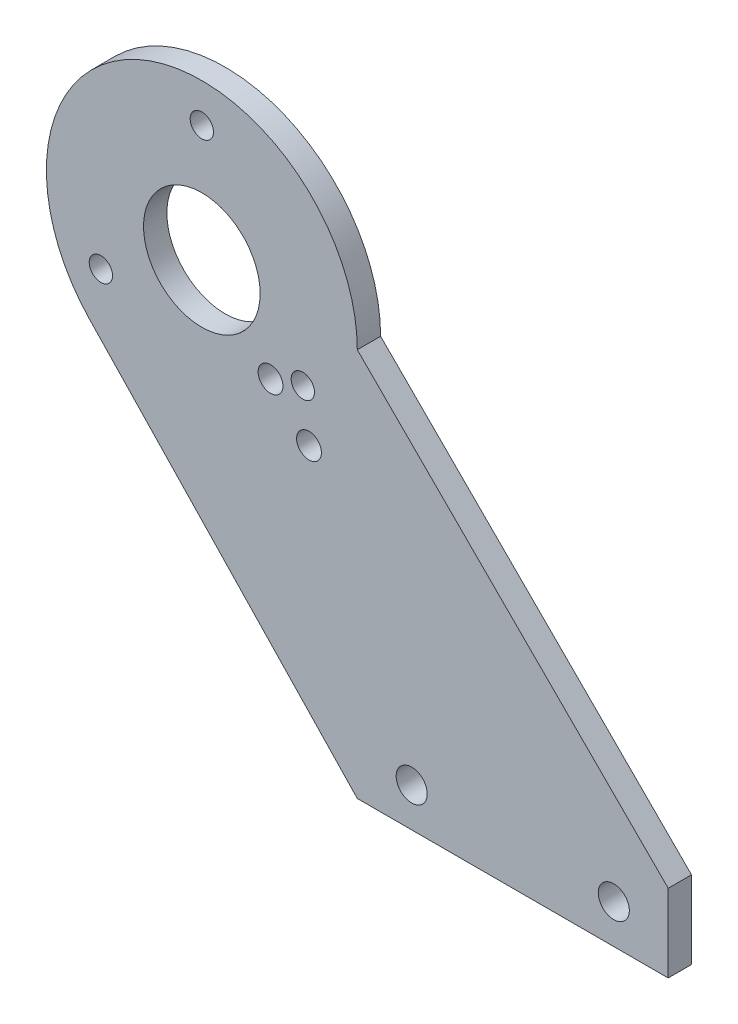
ISO-10303-21;
HEADER;
FILE_DESCRIPTION(('STEP AP214'),'2;1');
FILE_NAME('part.step','',(''),(''),'','','');
FILE_SCHEMA(('AUTOMOTIVE_DESIGN { 1 0 10303 214 1 1 1 1 }'));
ENDSEC;
DATA;
#1=APPLICATION_CONTEXT('core data for automotive mechanical design processes');
#2=APPLICATION_PROTOCOL_DEFINITION('international standard','automotive_design',2000,#1);
#3=PRODUCT_CONTEXT('',#1,'mechanical');
#4=PRODUCT('Part','Part','',(#3));
#5=PRODUCT_RELATED_PRODUCT_CATEGORY('part','',(#4));
#6=PRODUCT_DEFINITION_FORMATION('','',#4);
#7=PRODUCT_DEFINITION_CONTEXT('part definition',#1,'design');
#8=PRODUCT_DEFINITION('design','',#6,#7);
#9=PRODUCT_DEFINITION_SHAPE('','',#8);
#10=(LENGTH_UNIT() NAMED_UNIT(*) SI_UNIT(.MILLI.,.METRE.));
#11=(NAMED_UNIT(*) PLANE_ANGLE_UNIT() SI_UNIT($,.RADIAN.));
#12=(NAMED_UNIT(*) SI_UNIT($,.STERADIAN.) SOLID_ANGLE_UNIT());
#13=UNCERTAINTY_MEASURE_WITH_UNIT(LENGTH_MEASURE(1.E-05),#10,'distance_accuracy_value','');
#14=(GEOMETRIC_REPRESENTATION_CONTEXT(3) GLOBAL_UNCERTAINTY_ASSIGNED_CONTEXT((#13)) GLOBAL_UNIT_ASSIGNED_CONTEXT((#10,
#11,#12)) REPRESENTATION_CONTEXT('',''));
#15=CARTESIAN_POINT('',(0.,0.,0.));
#16=DIRECTION('',(0.,0.,1.));
#17=DIRECTION('',(1.,0.,0.));
#18=AXIS2_PLACEMENT_3D('',#15,#16,#17);
#19=CARTESIAN_POINT('',(0.,0.,3.));
#20=DIRECTION('',(0.,0.,1.));
#21=DIRECTION('',(1.,0.,0.));
#22=AXIS2_PLACEMENT_3D('',#19,#20,#21);
#23=PLANE('',#22);
#24=CARTESIAN_POINT('',(0.,0.,3.));
#25=DIRECTION('',(0.,0.,1.));
#26=DIRECTION('',(1.,0.,0.));
#27=AXIS2_PLACEMENT_3D('',#24,#25,#26);
#28=CIRCLE('',#27,7.5);
#29=CARTESIAN_POINT('',(7.5,0.,3.));
#30=VERTEX_POINT('',#29);
#31=EDGE_CURVE('E131',#30,#30,#28,.T.);
#32=ORIENTED_EDGE('',*,*,#31,.F.);
#33=EDGE_LOOP('',(#32));
#34=FACE_BOUND('',#33,.T.);
#35=CARTESIAN_POINT('',(12.9903810567675,-7.49999999999945,3.));
#36=DIRECTION('',(0.,0.,1.));
#37=DIRECTION('',(1.,0.,0.));
#38=AXIS2_PLACEMENT_3D('',#35,#36,#37);
#39=CIRCLE('',#38,1.50000000000082);
#40=CARTESIAN_POINT('',(14.4903810567684,-7.49999999999945,3.));
#41=VERTEX_POINT('',#40);
#42=EDGE_CURVE('E373',#41,#41,#39,.T.);
#43=ORIENTED_EDGE('',*,*,#42,.F.);
#44=EDGE_LOOP('',(#43));
#45=FACE_BOUND('',#44,.T.);
#46=CARTESIAN_POINT('',(-12.9903810567656,-7.50000000000055,3.));
#47=DIRECTION('',(0.,0.,1.));
#48=DIRECTION('',(1.,0.,0.));
#49=AXIS2_PLACEMENT_3D('',#46,#47,#48);
#50=CIRCLE('',#49,1.5000000000012);
#51=CARTESIAN_POINT('',(-11.4903810567644,-7.50000000000055,3.));
#52=VERTEX_POINT('',#51);
#53=EDGE_CURVE('E376',#52,#52,#50,.T.);
#54=ORIENTED_EDGE('',*,*,#53,.F.);
#55=EDGE_LOOP('',(#54));
#56=FACE_BOUND('',#55,.T.);
#57=CARTESIAN_POINT('',(13.7885822331377,-13.7885822331377,3.));
#58=DIRECTION('',(0.,0.,1.));
#59=DIRECTION('',(1.,0.,0.));
#60=AXIS2_PLACEMENT_3D('',#57,#58,#59);
#61=CIRCLE('',#60,1.6);
#62=CARTESIAN_POINT('',(15.3885822331377,-13.7885822331377,3.));
#63=VERTEX_POINT('',#62);
#64=EDGE_CURVE('E380',#63,#63,#61,.T.);
#65=ORIENTED_EDGE('',*,*,#64,.F.);
#66=EDGE_LOOP('',(#65));
#67=FACE_BOUND('',#66,.T.);
#68=CARTESIAN_POINT('',(8.83883476483185,-8.83883476483184,3.));
#69=DIRECTION('',(0.,0.,1.));
#70=DIRECTION('',(1.,0.,0.));
#71=AXIS2_PLACEMENT_3D('',#68,#69,#70);
#72=CIRCLE('',#71,1.6);
#73=CARTESIAN_POINT('',(10.4388347648318,-8.83883476483184,3.));
#74=VERTEX_POINT('',#73);
#75=EDGE_CURVE('E178',#74,#74,#72,.T.);
#76=ORIENTED_EDGE('',*,*,#75,.F.);
#77=EDGE_LOOP('',(#76));
#78=FACE_BOUND('',#77,.T.);
#79=CARTESIAN_POINT('',(0.,15.,3.));
#80=DIRECTION('',(0.,0.,1.));
#81=DIRECTION('',(1.,0.,0.));
#82=AXIS2_PLACEMENT_3D('',#79,#80,#81);
#83=CIRCLE('',#82,1.5);
#84=CARTESIAN_POINT('',(1.5,15.,3.));
#85=VERTEX_POINT('',#84);
#86=EDGE_CURVE('E153',#85,#85,#83,.T.);
#87=ORIENTED_EDGE('',*,*,#86,.F.);
#88=EDGE_LOOP('',(#87));
#89=FACE_BOUND('',#88,.T.);
#90=CARTESIAN_POINT('',(53.,-45.,3.));
#91=DIRECTION('',(0.,0.,1.));
#92=DIRECTION('',(-1.,0.,0.));
#93=AXIS2_PLACEMENT_3D('',#90,#91,#92);
#94=CIRCLE('',#93,2.);
#95=CARTESIAN_POINT('',(51.,-45.,3.));
#96=VERTEX_POINT('',#95);
#97=EDGE_CURVE('E180',#96,#96,#94,.T.);
#98=ORIENTED_EDGE('',*,*,#97,.F.);
#99=EDGE_LOOP('',(#98));
#100=FACE_BOUND('',#99,.T.);
#101=CARTESIAN_POINT('',(27.,-45.,3.));
#102=DIRECTION('',(0.,0.,1.));
#103=DIRECTION('',(1.,0.,0.));
#104=AXIS2_PLACEMENT_3D('',#101,#102,#103);
#105=CIRCLE('',#104,2.);
#106=CARTESIAN_POINT('',(29.,-45.,3.));
#107=VERTEX_POINT('',#106);
#108=EDGE_CURVE('E172',#107,#107,#105,.T.);
#109=ORIENTED_EDGE('',*,*,#108,.F.);
#110=EDGE_LOOP('',(#109));
#111=FACE_BOUND('',#110,.T.);
#112=DIRECTION('',(-0.707106781186548,0.707106781186547,0.));
#113=VECTOR('',#112,1.);
#114=CARTESIAN_POINT('',(20.,0.,3.));
#115=LINE('',#114,#113);
#116=CARTESIAN_POINT('',(60.,-40.,3.));
#117=VERTEX_POINT('',#116);
#118=CARTESIAN_POINT('',(20.,0.,3.));
#119=VERTEX_POINT('',#118);
#120=EDGE_CURVE('E101',#117,#119,#115,.T.);
#121=ORIENTED_EDGE('',*,*,#120,.T.);
#122=CARTESIAN_POINT('',(0.,0.,3.));
#123=DIRECTION('',(0.,0.,1.));
#124=DIRECTION('',(1.,0.,0.));
#125=AXIS2_PLACEMENT_3D('',#122,#123,#124);
#126=CIRCLE('',#125,20.);
#127=CARTESIAN_POINT('',(-14.4827586206896,-13.7931034482759,3.));
#128=VERTEX_POINT('',#127);
#129=EDGE_CURVE('E120',#119,#128,#126,.T.);
#130=ORIENTED_EDGE('',*,*,#129,.T.);
#131=DIRECTION('',(0.689655172413793,-0.724137931034483,0.));
#132=VECTOR('',#131,1.);
#133=CARTESIAN_POINT('',(20.,-50.,3.));
#134=LINE('',#133,#132);
#135=CARTESIAN_POINT('',(20.,-50.,3.));
#136=VERTEX_POINT('',#135);
#137=EDGE_CURVE('E205',#128,#136,#134,.T.);
#138=ORIENTED_EDGE('',*,*,#137,.T.);
#139=DIRECTION('',(1.,0.,0.));
#140=VECTOR('',#139,1.);
#141=CARTESIAN_POINT('',(20.,-50.,3.));
#142=LINE('',#141,#140);
#143=CARTESIAN_POINT('',(60.,-50.,3.));
#144=VERTEX_POINT('',#143);
#145=EDGE_CURVE('E70',#136,#144,#142,.T.);
#146=ORIENTED_EDGE('',*,*,#145,.T.);
#147=DIRECTION('',(0.,1.,0.));
#148=VECTOR('',#147,1.);
#149=CARTESIAN_POINT('',(60.,-40.,3.));
#150=LINE('',#149,#148);
#151=EDGE_CURVE('E139',#144,#117,#150,.T.);
#152=ORIENTED_EDGE('',*,*,#151,.T.);
#153=EDGE_LOOP('',(#121,#130,#138,#146,#152));
#154=FACE_BOUND('',#153,.T.);
#155=ADVANCED_FACE('F50',(#34,#45,#56,#67,#78,#89,#100,#111,#154),#23,.T.);
#156=CARTESIAN_POINT('',(0.,0.,0.));
#157=DIRECTION('',(0.,0.,1.));
#158=DIRECTION('',(1.,0.,0.));
#159=AXIS2_PLACEMENT_3D('',#156,#157,#158);
#160=PLANE('',#159);
#161=CARTESIAN_POINT('',(0.,0.,0.));
#162=DIRECTION('',(0.,0.,1.));
#163=DIRECTION('',(1.,0.,0.));
#164=AXIS2_PLACEMENT_3D('',#161,#162,#163);
#165=CIRCLE('',#164,7.5);
#166=CARTESIAN_POINT('',(7.5,0.,0.));
#167=VERTEX_POINT('',#166);
#168=EDGE_CURVE('E168',#167,#167,#165,.T.);
#169=ORIENTED_EDGE('',*,*,#168,.T.);
#170=EDGE_LOOP('',(#169));
#171=FACE_BOUND('',#170,.T.);
#172=CARTESIAN_POINT('',(12.9903810567675,-7.49999999999945,0.));
#173=DIRECTION('',(0.,0.,1.));
#174=DIRECTION('',(1.,0.,0.));
#175=AXIS2_PLACEMENT_3D('',#172,#173,#174);
#176=CIRCLE('',#175,1.50000000000082);
#177=CARTESIAN_POINT('',(14.4903810567684,-7.49999999999945,0.));
#178=VERTEX_POINT('',#177);
#179=EDGE_CURVE('E148',#178,#178,#176,.F.);
#180=ORIENTED_EDGE('',*,*,#179,.F.);
#181=EDGE_LOOP('',(#180));
#182=FACE_BOUND('',#181,.T.);
#183=CARTESIAN_POINT('',(-12.9903810567656,-7.50000000000055,0.));
#184=DIRECTION('',(0.,0.,1.));
#185=DIRECTION('',(1.,0.,0.));
#186=AXIS2_PLACEMENT_3D('',#183,#184,#185);
#187=CIRCLE('',#186,1.5000000000012);
#188=CARTESIAN_POINT('',(-11.4903810567644,-7.50000000000055,0.));
#189=VERTEX_POINT('',#188);
#190=EDGE_CURVE('E152',#189,#189,#187,.F.);
#191=ORIENTED_EDGE('',*,*,#190,.F.);
#192=EDGE_LOOP('',(#191));
#193=FACE_BOUND('',#192,.T.);
#194=CARTESIAN_POINT('',(13.7885822331377,-13.7885822331377,0.));
#195=DIRECTION('',(0.,0.,1.));
#196=DIRECTION('',(1.,0.,0.));
#197=AXIS2_PLACEMENT_3D('',#194,#195,#196);
#198=CIRCLE('',#197,1.6);
#199=CARTESIAN_POINT('',(15.3885822331377,-13.7885822331377,0.));
#200=VERTEX_POINT('',#199);
#201=EDGE_CURVE('E157',#200,#200,#198,.F.);
#202=ORIENTED_EDGE('',*,*,#201,.F.);
#203=EDGE_LOOP('',(#202));
#204=FACE_BOUND('',#203,.T.);
#205=CARTESIAN_POINT('',(8.83883476483185,-8.83883476483184,0.));
#206=DIRECTION('',(0.,0.,1.));
#207=DIRECTION('',(1.,0.,0.));
#208=AXIS2_PLACEMENT_3D('',#205,#206,#207);
#209=CIRCLE('',#208,1.6);
#210=CARTESIAN_POINT('',(10.4388347648318,-8.83883476483184,0.));
#211=VERTEX_POINT('',#210);
#212=EDGE_CURVE('E161',#211,#211,#209,.F.);
#213=ORIENTED_EDGE('',*,*,#212,.F.);
#214=EDGE_LOOP('',(#213));
#215=FACE_BOUND('',#214,.T.);
#216=CARTESIAN_POINT('',(0.,15.,0.));
#217=DIRECTION('',(0.,0.,1.));
#218=DIRECTION('',(1.,0.,0.));
#219=AXIS2_PLACEMENT_3D('',#216,#217,#218);
#220=CIRCLE('',#219,1.5);
#221=CARTESIAN_POINT('',(1.5,15.,0.));
#222=VERTEX_POINT('',#221);
#223=EDGE_CURVE('E165',#222,#222,#220,.F.);
#224=ORIENTED_EDGE('',*,*,#223,.F.);
#225=EDGE_LOOP('',(#224));
#226=FACE_BOUND('',#225,.T.);
#227=CARTESIAN_POINT('',(53.,-45.,0.));
#228=DIRECTION('',(0.,0.,1.));
#229=DIRECTION('',(1.,0.,0.));
#230=AXIS2_PLACEMENT_3D('',#227,#228,#229);
#231=CIRCLE('',#230,2.);
#232=CARTESIAN_POINT('',(55.,-45.,0.));
#233=VERTEX_POINT('',#232);
#234=EDGE_CURVE('E169',#233,#233,#231,.F.);
#235=ORIENTED_EDGE('',*,*,#234,.F.);
#236=EDGE_LOOP('',(#235));
#237=FACE_BOUND('',#236,.T.);
#238=CARTESIAN_POINT('',(27.,-45.,0.));
#239=DIRECTION('',(0.,0.,1.));
#240=DIRECTION('',(1.,0.,0.));
#241=AXIS2_PLACEMENT_3D('',#238,#239,#240);
#242=CIRCLE('',#241,2.);
#243=CARTESIAN_POINT('',(29.,-45.,0.));
#244=VERTEX_POINT('',#243);
#245=EDGE_CURVE('E54',#244,#244,#242,.F.);
#246=ORIENTED_EDGE('',*,*,#245,.F.);
#247=EDGE_LOOP('',(#246));
#248=FACE_BOUND('',#247,.T.);
#249=CARTESIAN_POINT('',(0.,0.,0.));
#250=DIRECTION('',(0.,0.,1.));
#251=DIRECTION('',(1.,0.,0.));
#252=AXIS2_PLACEMENT_3D('',#249,#250,#251);
#253=CIRCLE('',#252,20.);
#254=CARTESIAN_POINT('',(20.,0.,0.));
#255=VERTEX_POINT('',#254);
#256=CARTESIAN_POINT('',(-14.4827586206896,-13.7931034482759,0.));
#257=VERTEX_POINT('',#256);
#258=EDGE_CURVE('E109',#255,#257,#253,.T.);
#259=ORIENTED_EDGE('',*,*,#258,.F.);
#260=DIRECTION('',(-0.707106781186548,0.707106781186547,0.));
#261=VECTOR('',#260,1.);
#262=CARTESIAN_POINT('',(20.,0.,0.));
#263=LINE('',#262,#261);
#264=CARTESIAN_POINT('',(60.,-40.,0.));
#265=VERTEX_POINT('',#264);
#266=EDGE_CURVE('E114',#265,#255,#263,.T.);
#267=ORIENTED_EDGE('',*,*,#266,.F.);
#268=DIRECTION('',(0.,1.,0.));
#269=VECTOR('',#268,1.);
#270=CARTESIAN_POINT('',(60.,-40.,0.));
#271=LINE('',#270,#269);
#272=CARTESIAN_POINT('',(60.,-50.,0.));
#273=VERTEX_POINT('',#272);
#274=EDGE_CURVE('E128',#273,#265,#271,.T.);
#275=ORIENTED_EDGE('',*,*,#274,.F.);
#276=DIRECTION('',(1.,0.,0.));
#277=VECTOR('',#276,1.);
#278=CARTESIAN_POINT('',(20.,-50.,0.));
#279=LINE('',#278,#277);
#280=CARTESIAN_POINT('',(20.,-50.,0.));
#281=VERTEX_POINT('',#280);
#282=EDGE_CURVE('E94',#281,#273,#279,.T.);
#283=ORIENTED_EDGE('',*,*,#282,.F.);
#284=DIRECTION('',(0.689655172413793,-0.724137931034483,0.));
#285=VECTOR('',#284,1.);
#286=CARTESIAN_POINT('',(20.,-50.,0.));
#287=LINE('',#286,#285);
#288=EDGE_CURVE('E88',#257,#281,#287,.T.);
#289=ORIENTED_EDGE('',*,*,#288,.F.);
#290=EDGE_LOOP('',(#259,#267,#275,#283,#289));
#291=FACE_BOUND('',#290,.T.);
#292=ADVANCED_FACE('F111',(#171,#182,#193,#204,#215,#226,#237,#248,#291),#160,.F.);
#293=CARTESIAN_POINT('',(60.,-40.,3.));
#294=DIRECTION('',(-1.,0.,0.));
#295=DIRECTION('',(0.,-1.,0.));
#296=AXIS2_PLACEMENT_3D('',#293,#294,#295);
#297=PLANE('',#296);
#298=ORIENTED_EDGE('',*,*,#274,.T.);
#299=DIRECTION('',(0.,0.,-1.));
#300=VECTOR('',#299,1.);
#301=CARTESIAN_POINT('',(60.,-40.,3.));
#302=LINE('',#301,#300);
#303=EDGE_CURVE('E12',#117,#265,#302,.T.);
#304=ORIENTED_EDGE('',*,*,#303,.F.);
#305=ORIENTED_EDGE('',*,*,#151,.F.);
#306=DIRECTION('',(0.,0.,-1.));
#307=VECTOR('',#306,1.);
#308=CARTESIAN_POINT('',(60.,-50.,3.));
#309=LINE('',#308,#307);
#310=EDGE_CURVE('E140',#144,#273,#309,.T.);
#311=ORIENTED_EDGE('',*,*,#310,.T.);
#312=EDGE_LOOP('',(#298,#304,#305,#311));
#313=FACE_BOUND('',#312,.T.);
#314=ADVANCED_FACE('F52',(#313),#297,.F.);
#315=CARTESIAN_POINT('',(20.,0.,3.));
#316=DIRECTION('',(-0.707106781186547,-0.707106781186548,0.));
#317=DIRECTION('',(0.707106781186548,-0.707106781186547,0.));
#318=AXIS2_PLACEMENT_3D('',#315,#316,#317);
#319=PLANE('',#318);
#320=ORIENTED_EDGE('',*,*,#266,.T.);
#321=DIRECTION('',(0.,0.,-1.));
#322=VECTOR('',#321,1.);
#323=CARTESIAN_POINT('',(20.,0.,3.));
#324=LINE('',#323,#322);
#325=EDGE_CURVE('E61',#119,#255,#324,.T.);
#326=ORIENTED_EDGE('',*,*,#325,.F.);
#327=ORIENTED_EDGE('',*,*,#120,.F.);
#328=ORIENTED_EDGE('',*,*,#303,.T.);
#329=EDGE_LOOP('',(#320,#326,#327,#328));
#330=FACE_BOUND('',#329,.T.);
#331=ADVANCED_FACE('F124',(#330),#319,.F.);
#332=CARTESIAN_POINT('',(0.,0.,3.));
#333=DIRECTION('',(0.,0.,-1.));
#334=DIRECTION('',(-1.,0.,0.));
#335=AXIS2_PLACEMENT_3D('',#332,#333,#334);
#336=CYLINDRICAL_SURFACE('',#335,20.);
#337=ORIENTED_EDGE('',*,*,#258,.T.);
#338=DIRECTION('',(0.,0.,-1.));
#339=VECTOR('',#338,1.);
#340=CARTESIAN_POINT('',(-14.4827586206896,-13.7931034482759,3.));
#341=LINE('',#340,#339);
#342=EDGE_CURVE('E122',#128,#257,#341,.T.);
#343=ORIENTED_EDGE('',*,*,#342,.F.);
#344=ORIENTED_EDGE('',*,*,#129,.F.);
#345=ORIENTED_EDGE('',*,*,#325,.T.);
#346=EDGE_LOOP('',(#337,#343,#344,#345));
#347=FACE_BOUND('',#346,.T.);
#348=ADVANCED_FACE('F119',(#347),#336,.T.);
#349=CARTESIAN_POINT('',(20.,-50.,3.));
#350=DIRECTION('',(0.724137931034483,0.689655172413793,0.));
#351=DIRECTION('',(-0.689655172413793,0.724137931034483,0.));
#352=AXIS2_PLACEMENT_3D('',#349,#350,#351);
#353=PLANE('',#352);
#354=ORIENTED_EDGE('',*,*,#288,.T.);
#355=DIRECTION('',(0.,0.,-1.));
#356=VECTOR('',#355,1.);
#357=CARTESIAN_POINT('',(20.,-50.,3.));
#358=LINE('',#357,#356);
#359=EDGE_CURVE('E143',#136,#281,#358,.T.);
#360=ORIENTED_EDGE('',*,*,#359,.F.);
#361=ORIENTED_EDGE('',*,*,#137,.F.);
#362=ORIENTED_EDGE('',*,*,#342,.T.);
#363=EDGE_LOOP('',(#354,#360,#361,#362));
#364=FACE_BOUND('',#363,.T.);
#365=ADVANCED_FACE('F215',(#364),#353,.F.);
#366=CARTESIAN_POINT('',(20.,-50.,3.));
#367=DIRECTION('',(0.,1.,0.));
#368=DIRECTION('',(0.,0.,1.));
#369=AXIS2_PLACEMENT_3D('',#366,#367,#368);
#370=PLANE('',#369);
#371=ORIENTED_EDGE('',*,*,#282,.T.);
#372=ORIENTED_EDGE('',*,*,#310,.F.);
#373=ORIENTED_EDGE('',*,*,#145,.F.);
#374=ORIENTED_EDGE('',*,*,#359,.T.);
#375=EDGE_LOOP('',(#371,#372,#373,#374));
#376=FACE_BOUND('',#375,.T.);
#377=ADVANCED_FACE('F213',(#376),#370,.F.);
#378=CARTESIAN_POINT('',(0.,0.,3.));
#379=DIRECTION('',(0.,0.,-1.));
#380=DIRECTION('',(-1.,0.,0.));
#381=AXIS2_PLACEMENT_3D('',#378,#379,#380);
#382=CYLINDRICAL_SURFACE('',#381,7.5);
#383=ORIENTED_EDGE('',*,*,#31,.T.);
#384=EDGE_LOOP('',(#383));
#385=FACE_BOUND('',#384,.T.);
#386=ORIENTED_EDGE('',*,*,#168,.F.);
#387=EDGE_LOOP('',(#386));
#388=FACE_BOUND('',#387,.T.);
#389=ADVANCED_FACE('F222',(#385,#388),#382,.F.);
#390=CARTESIAN_POINT('',(12.9903810567675,-7.49999999999945,3.));
#391=DIRECTION('',(0.,0.,-1.));
#392=DIRECTION('',(-1.,0.,0.));
#393=AXIS2_PLACEMENT_3D('',#390,#391,#392);
#394=CYLINDRICAL_SURFACE('',#393,1.50000000000082);
#395=ORIENTED_EDGE('',*,*,#42,.T.);
#396=EDGE_LOOP('',(#395));
#397=FACE_BOUND('',#396,.T.);
#398=ORIENTED_EDGE('',*,*,#179,.T.);
#399=EDGE_LOOP('',(#398));
#400=FACE_BOUND('',#399,.T.);
#401=ADVANCED_FACE('F240',(#397,#400),#394,.F.);
#402=CARTESIAN_POINT('',(-12.9903810567656,-7.50000000000055,3.));
#403=DIRECTION('',(0.,0.,-1.));
#404=DIRECTION('',(-1.,0.,0.));
#405=AXIS2_PLACEMENT_3D('',#402,#403,#404);
#406=CYLINDRICAL_SURFACE('',#405,1.5000000000012);
#407=ORIENTED_EDGE('',*,*,#53,.T.);
#408=EDGE_LOOP('',(#407));
#409=FACE_BOUND('',#408,.T.);
#410=ORIENTED_EDGE('',*,*,#190,.T.);
#411=EDGE_LOOP('',(#410));
#412=FACE_BOUND('',#411,.T.);
#413=ADVANCED_FACE('F242',(#409,#412),#406,.F.);
#414=CARTESIAN_POINT('',(13.7885822331377,-13.7885822331377,3.));
#415=DIRECTION('',(0.,0.,-1.));
#416=DIRECTION('',(-1.,0.,0.));
#417=AXIS2_PLACEMENT_3D('',#414,#415,#416);
#418=CYLINDRICAL_SURFACE('',#417,1.6);
#419=ORIENTED_EDGE('',*,*,#64,.T.);
#420=EDGE_LOOP('',(#419));
#421=FACE_BOUND('',#420,.T.);
#422=ORIENTED_EDGE('',*,*,#201,.T.);
#423=EDGE_LOOP('',(#422));
#424=FACE_BOUND('',#423,.T.);
#425=ADVANCED_FACE('F245',(#421,#424),#418,.F.);
#426=CARTESIAN_POINT('',(8.83883476483185,-8.83883476483184,3.));
#427=DIRECTION('',(0.,0.,-1.));
#428=DIRECTION('',(-1.,0.,0.));
#429=AXIS2_PLACEMENT_3D('',#426,#427,#428);
#430=CYLINDRICAL_SURFACE('',#429,1.6);
#431=ORIENTED_EDGE('',*,*,#75,.T.);
#432=EDGE_LOOP('',(#431));
#433=FACE_BOUND('',#432,.T.);
#434=ORIENTED_EDGE('',*,*,#212,.T.);
#435=EDGE_LOOP('',(#434));
#436=FACE_BOUND('',#435,.T.);
#437=ADVANCED_FACE('F250',(#433,#436),#430,.F.);
#438=CARTESIAN_POINT('',(0.,15.,3.));
#439=DIRECTION('',(0.,0.,-1.));
#440=DIRECTION('',(-1.,0.,0.));
#441=AXIS2_PLACEMENT_3D('',#438,#439,#440);
#442=CYLINDRICAL_SURFACE('',#441,1.5);
#443=ORIENTED_EDGE('',*,*,#86,.T.);
#444=EDGE_LOOP('',(#443));
#445=FACE_BOUND('',#444,.T.);
#446=ORIENTED_EDGE('',*,*,#223,.T.);
#447=EDGE_LOOP('',(#446));
#448=FACE_BOUND('',#447,.T.);
#449=ADVANCED_FACE('F253',(#445,#448),#442,.F.);
#450=CARTESIAN_POINT('',(53.,-45.,3.));
#451=DIRECTION('',(0.,0.,-1.));
#452=DIRECTION('',(-1.,0.,0.));
#453=AXIS2_PLACEMENT_3D('',#450,#451,#452);
#454=CYLINDRICAL_SURFACE('',#453,2.);
#455=ORIENTED_EDGE('',*,*,#97,.T.);
#456=EDGE_LOOP('',(#455));
#457=FACE_BOUND('',#456,.T.);
#458=ORIENTED_EDGE('',*,*,#234,.T.);
#459=EDGE_LOOP('',(#458));
#460=FACE_BOUND('',#459,.T.);
#461=ADVANCED_FACE('F260',(#457,#460),#454,.F.);
#462=CARTESIAN_POINT('',(27.,-45.,3.));
#463=DIRECTION('',(0.,0.,-1.));
#464=DIRECTION('',(-1.,0.,0.));
#465=AXIS2_PLACEMENT_3D('',#462,#463,#464);
#466=CYLINDRICAL_SURFACE('',#465,2.);
#467=ORIENTED_EDGE('',*,*,#108,.T.);
#468=EDGE_LOOP('',(#467));
#469=FACE_BOUND('',#468,.T.);
#470=ORIENTED_EDGE('',*,*,#245,.T.);
#471=EDGE_LOOP('',(#470));
#472=FACE_BOUND('',#471,.T.);
#473=ADVANCED_FACE('F264',(#469,#472),#466,.F.);
#474=CLOSED_SHELL('',(#155,#292,#314,#331,#348,#365,#377,#389,#401,#413,#425,#437,#449,#461,#473));
#475=MANIFOLD_SOLID_BREP('B2',#474);
#476=ADVANCED_BREP_SHAPE_REPRESENTATION('',(#18,#475),#14);
#477=SHAPE_DEFINITION_REPRESENTATION(#9,#476);
ENDSEC;
END-ISO-10303-21;
